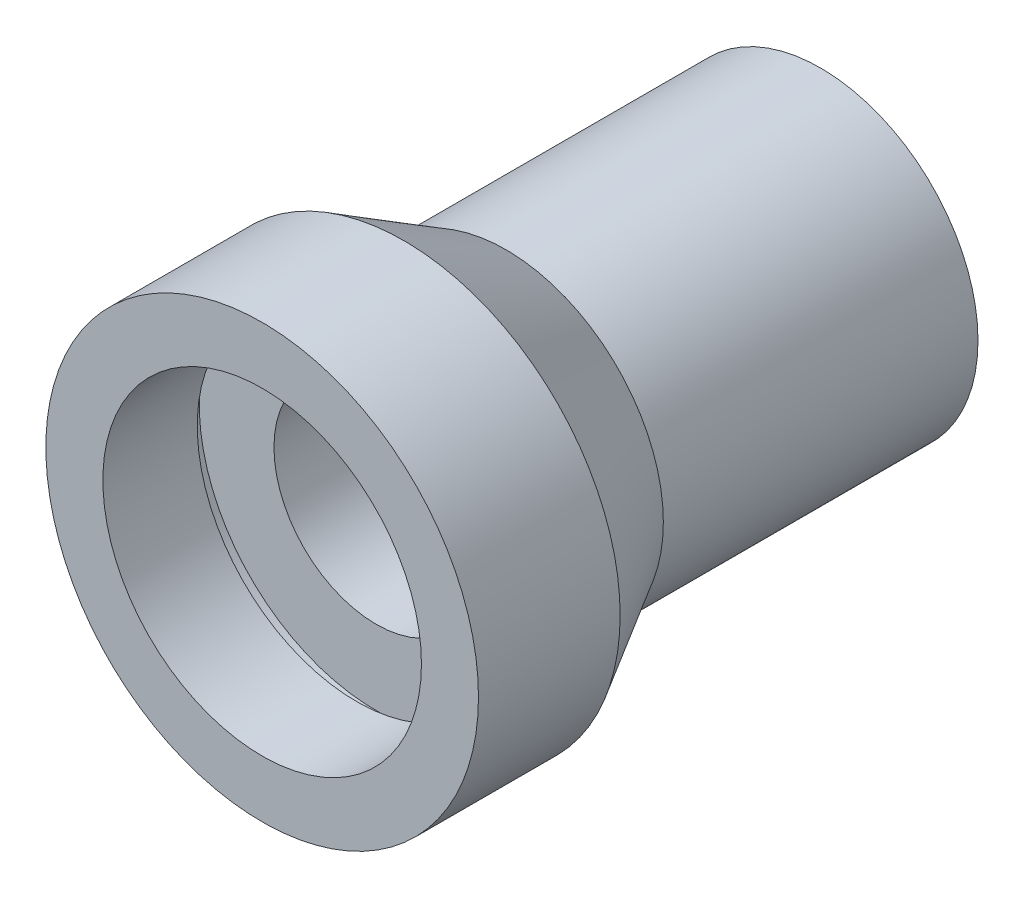
ISO-10303-21;
HEADER;
FILE_DESCRIPTION(('STEP AP214'),'2;1');
FILE_NAME('part.step','',(''),(''),'','','');
FILE_SCHEMA(('AUTOMOTIVE_DESIGN { 1 0 10303 214 1 1 1 1 }'));
ENDSEC;
DATA;
#1=APPLICATION_CONTEXT('core data for automotive mechanical design processes');
#2=APPLICATION_PROTOCOL_DEFINITION('international standard','automotive_design',2000,#1);
#3=PRODUCT_CONTEXT('',#1,'mechanical');
#4=PRODUCT('Part','Part','',(#3));
#5=PRODUCT_RELATED_PRODUCT_CATEGORY('part','',(#4));
#6=PRODUCT_DEFINITION_FORMATION('','',#4);
#7=PRODUCT_DEFINITION_CONTEXT('part definition',#1,'design');
#8=PRODUCT_DEFINITION('design','',#6,#7);
#9=PRODUCT_DEFINITION_SHAPE('','',#8);
#10=(LENGTH_UNIT() NAMED_UNIT(*) SI_UNIT(.MILLI.,.METRE.));
#11=(NAMED_UNIT(*) PLANE_ANGLE_UNIT() SI_UNIT($,.RADIAN.));
#12=(NAMED_UNIT(*) SI_UNIT($,.STERADIAN.) SOLID_ANGLE_UNIT());
#13=UNCERTAINTY_MEASURE_WITH_UNIT(LENGTH_MEASURE(1.E-05),#10,'distance_accuracy_value','');
#14=(GEOMETRIC_REPRESENTATION_CONTEXT(3) GLOBAL_UNCERTAINTY_ASSIGNED_CONTEXT((#13)) GLOBAL_UNIT_ASSIGNED_CONTEXT((#10,
#11,#12)) REPRESENTATION_CONTEXT('',''));
#15=CARTESIAN_POINT('',(0.,0.,0.));
#16=DIRECTION('',(0.,0.,1.));
#17=DIRECTION('',(1.,0.,0.));
#18=AXIS2_PLACEMENT_3D('',#15,#16,#17);
#19=CARTESIAN_POINT('',(0.,0.,-10.));
#20=DIRECTION('',(0.,0.,1.));
#21=DIRECTION('',(1.,0.,0.));
#22=AXIS2_PLACEMENT_3D('',#19,#20,#21);
#23=CYLINDRICAL_SURFACE('',#22,4.);
#24=CARTESIAN_POINT('',(0.,0.,-2.00000000000001));
#25=DIRECTION('',(0.,0.,1.));
#26=DIRECTION('',(1.,0.,0.));
#27=AXIS2_PLACEMENT_3D('',#24,#25,#26);
#28=CIRCLE('',#27,4.);
#29=CARTESIAN_POINT('',(4.,0.,-2.00000000000001));
#30=VERTEX_POINT('',#29);
#31=EDGE_CURVE('E44',#30,#30,#28,.F.);
#32=ORIENTED_EDGE('',*,*,#31,.T.);
#33=EDGE_LOOP('',(#32));
#34=FACE_BOUND('',#33,.T.);
#35=CARTESIAN_POINT('',(0.,0.,-10.));
#36=DIRECTION('',(0.,0.,1.));
#37=DIRECTION('',(1.,0.,0.));
#38=AXIS2_PLACEMENT_3D('',#35,#36,#37);
#39=CIRCLE('',#38,4.);
#40=CARTESIAN_POINT('',(4.,0.,-10.));
#41=VERTEX_POINT('',#40);
#42=EDGE_CURVE('E48',#41,#41,#39,.T.);
#43=ORIENTED_EDGE('',*,*,#42,.T.);
#44=EDGE_LOOP('',(#43));
#45=FACE_BOUND('',#44,.T.);
#46=ADVANCED_FACE('F36',(#34,#45),#23,.T.);
#47=CARTESIAN_POINT('',(0.,0.,-10.));
#48=DIRECTION('',(0.,0.,1.));
#49=DIRECTION('',(1.,0.,0.));
#50=AXIS2_PLACEMENT_3D('',#47,#48,#49);
#51=PLANE('',#50);
#52=CARTESIAN_POINT('',(0.,0.,-10.));
#53=DIRECTION('',(0.,0.,1.));
#54=DIRECTION('',(1.,0.,0.));
#55=AXIS2_PLACEMENT_3D('',#52,#53,#54);
#56=CIRCLE('',#55,2.6);
#57=CARTESIAN_POINT('',(2.6,0.,-10.));
#58=VERTEX_POINT('',#57);
#59=EDGE_CURVE('E52',#58,#58,#56,.T.);
#60=ORIENTED_EDGE('',*,*,#59,.T.);
#61=EDGE_LOOP('',(#60));
#62=FACE_BOUND('',#61,.T.);
#63=ORIENTED_EDGE('',*,*,#42,.F.);
#64=EDGE_LOOP('',(#63));
#65=FACE_BOUND('',#64,.T.);
#66=ADVANCED_FACE('F105',(#62,#65),#51,.F.);
#67=CARTESIAN_POINT('',(0.,0.,-10.));
#68=DIRECTION('',(0.,0.,1.));
#69=DIRECTION('',(1.,0.,0.));
#70=AXIS2_PLACEMENT_3D('',#67,#68,#69);
#71=CYLINDRICAL_SURFACE('',#70,2.6);
#72=ORIENTED_EDGE('',*,*,#59,.F.);
#73=EDGE_LOOP('',(#72));
#74=FACE_BOUND('',#73,.T.);
#75=CARTESIAN_POINT('',(0.,0.,1.3));
#76=DIRECTION('',(0.,0.,1.));
#77=DIRECTION('',(1.,0.,0.));
#78=AXIS2_PLACEMENT_3D('',#75,#76,#77);
#79=CIRCLE('',#78,2.6);
#80=CARTESIAN_POINT('',(2.6,0.,1.3));
#81=VERTEX_POINT('',#80);
#82=EDGE_CURVE('E58',#81,#81,#79,.T.);
#83=ORIENTED_EDGE('',*,*,#82,.T.);
#84=EDGE_LOOP('',(#83));
#85=FACE_BOUND('',#84,.T.);
#86=ADVANCED_FACE('F100',(#74,#85),#71,.F.);
#87=CARTESIAN_POINT('',(0.,0.,4.2));
#88=DIRECTION('',(0.,0.,-1.));
#89=DIRECTION('',(-1.,0.,0.));
#90=AXIS2_PLACEMENT_3D('',#87,#88,#89);
#91=CYLINDRICAL_SURFACE('',#90,5.5);
#92=CARTESIAN_POINT('',(0.,0.,0.598076211353264));
#93=DIRECTION('',(0.,0.,1.));
#94=DIRECTION('',(1.,0.,0.));
#95=AXIS2_PLACEMENT_3D('',#92,#93,#94);
#96=CIRCLE('',#95,5.5);
#97=CARTESIAN_POINT('',(5.5,0.,0.598076211353264));
#98=VERTEX_POINT('',#97);
#99=EDGE_CURVE('E10',#98,#98,#96,.T.);
#100=ORIENTED_EDGE('',*,*,#99,.T.);
#101=EDGE_LOOP('',(#100));
#102=FACE_BOUND('',#101,.T.);
#103=CARTESIAN_POINT('',(0.,0.,4.2));
#104=DIRECTION('',(0.,0.,1.));
#105=DIRECTION('',(1.,0.,0.));
#106=AXIS2_PLACEMENT_3D('',#103,#104,#105);
#107=CIRCLE('',#106,5.5);
#108=CARTESIAN_POINT('',(5.5,0.,4.2));
#109=VERTEX_POINT('',#108);
#110=EDGE_CURVE('E65',#109,#109,#107,.T.);
#111=ORIENTED_EDGE('',*,*,#110,.F.);
#112=EDGE_LOOP('',(#111));
#113=FACE_BOUND('',#112,.T.);
#114=ADVANCED_FACE('F95',(#102,#113),#91,.T.);
#115=CARTESIAN_POINT('',(0.,0.,4.2));
#116=DIRECTION('',(0.,0.,1.));
#117=DIRECTION('',(1.,0.,0.));
#118=AXIS2_PLACEMENT_3D('',#115,#116,#117);
#119=PLANE('',#118);
#120=CARTESIAN_POINT('',(0.,0.,4.2));
#121=DIRECTION('',(0.,0.,1.));
#122=DIRECTION('',(1.,0.,0.));
#123=AXIS2_PLACEMENT_3D('',#120,#121,#122);
#124=CIRCLE('',#123,4.05);
#125=CARTESIAN_POINT('',(4.05,0.,4.2));
#126=VERTEX_POINT('',#125);
#127=EDGE_CURVE('E61',#126,#126,#124,.T.);
#128=ORIENTED_EDGE('',*,*,#127,.F.);
#129=EDGE_LOOP('',(#128));
#130=FACE_BOUND('',#129,.T.);
#131=ORIENTED_EDGE('',*,*,#110,.T.);
#132=EDGE_LOOP('',(#131));
#133=FACE_BOUND('',#132,.T.);
#134=ADVANCED_FACE('F89',(#130,#133),#119,.T.);
#135=CARTESIAN_POINT('',(0.,0.,1.3));
#136=DIRECTION('',(0.,0.,1.));
#137=DIRECTION('',(1.,0.,0.));
#138=AXIS2_PLACEMENT_3D('',#135,#136,#137);
#139=CYLINDRICAL_SURFACE('',#138,4.05);
#140=CARTESIAN_POINT('',(0.,0.,1.8));
#141=DIRECTION('',(0.,0.,1.));
#142=DIRECTION('',(1.,0.,0.));
#143=AXIS2_PLACEMENT_3D('',#140,#141,#142);
#144=CIRCLE('',#143,4.05);
#145=CARTESIAN_POINT('',(4.05,0.,1.8));
#146=VERTEX_POINT('',#145);
#147=EDGE_CURVE('E55',#146,#146,#144,.F.);
#148=ORIENTED_EDGE('',*,*,#147,.T.);
#149=EDGE_LOOP('',(#148));
#150=FACE_BOUND('',#149,.T.);
#151=ORIENTED_EDGE('',*,*,#127,.T.);
#152=EDGE_LOOP('',(#151));
#153=FACE_BOUND('',#152,.T.);
#154=ADVANCED_FACE('F86',(#150,#153),#139,.F.);
#155=CARTESIAN_POINT('',(0.,0.,1.3));
#156=DIRECTION('',(0.,0.,1.));
#157=DIRECTION('',(1.,0.,0.));
#158=AXIS2_PLACEMENT_3D('',#155,#156,#157);
#159=PLANE('',#158);
#160=ORIENTED_EDGE('',*,*,#82,.F.);
#161=EDGE_LOOP('',(#160));
#162=FACE_BOUND('',#161,.T.);
#163=CARTESIAN_POINT('',(0.,0.,1.3));
#164=DIRECTION('',(0.,0.,1.));
#165=DIRECTION('',(1.,0.,0.));
#166=AXIS2_PLACEMENT_3D('',#163,#164,#165);
#167=CIRCLE('',#166,4.5);
#168=CARTESIAN_POINT('',(4.5,0.,1.3));
#169=VERTEX_POINT('',#168);
#170=EDGE_CURVE('E70',#169,#169,#167,.T.);
#171=ORIENTED_EDGE('',*,*,#170,.T.);
#172=EDGE_LOOP('',(#171));
#173=FACE_BOUND('',#172,.T.);
#174=ADVANCED_FACE('F82',(#162,#173),#159,.T.);
#175=CARTESIAN_POINT('',(0.,0.,1.8));
#176=DIRECTION('',(0.,0.,1.));
#177=DIRECTION('',(1.,0.,0.));
#178=AXIS2_PLACEMENT_3D('',#175,#176,#177);
#179=PLANE('',#178);
#180=CARTESIAN_POINT('',(0.,0.,1.8));
#181=DIRECTION('',(0.,0.,1.));
#182=DIRECTION('',(1.,0.,0.));
#183=AXIS2_PLACEMENT_3D('',#180,#181,#182);
#184=CIRCLE('',#183,4.5);
#185=CARTESIAN_POINT('',(4.5,0.,1.8));
#186=VERTEX_POINT('',#185);
#187=EDGE_CURVE('E59',#186,#186,#184,.T.);
#188=ORIENTED_EDGE('',*,*,#187,.F.);
#189=EDGE_LOOP('',(#188));
#190=FACE_BOUND('',#189,.T.);
#191=ORIENTED_EDGE('',*,*,#147,.F.);
#192=EDGE_LOOP('',(#191));
#193=FACE_BOUND('',#192,.T.);
#194=ADVANCED_FACE('F79',(#190,#193),#179,.F.);
#195=CARTESIAN_POINT('',(0.,0.,1.8));
#196=DIRECTION('',(0.,0.,-1.));
#197=DIRECTION('',(-1.,0.,0.));
#198=AXIS2_PLACEMENT_3D('',#195,#196,#197);
#199=CYLINDRICAL_SURFACE('',#198,4.5);
#200=ORIENTED_EDGE('',*,*,#187,.T.);
#201=EDGE_LOOP('',(#200));
#202=FACE_BOUND('',#201,.T.);
#203=ORIENTED_EDGE('',*,*,#170,.F.);
#204=EDGE_LOOP('',(#203));
#205=FACE_BOUND('',#204,.T.);
#206=ADVANCED_FACE('F76',(#202,#205),#199,.F.);
#207=CARTESIAN_POINT('',(0.,0.,0.999999999999999));
#208=DIRECTION('',(0.,0.,1.));
#209=DIRECTION('',(1.,0.,0.));
#210=AXIS2_PLACEMENT_3D('',#207,#208,#209);
#211=CONICAL_SURFACE('',#210,5.73205080756891,0.523598775598305);
#212=ORIENTED_EDGE('',*,*,#31,.F.);
#213=EDGE_LOOP('',(#212));
#214=FACE_BOUND('',#213,.T.);
#215=ORIENTED_EDGE('',*,*,#99,.F.);
#216=EDGE_LOOP('',(#215));
#217=FACE_BOUND('',#216,.T.);
#218=ADVANCED_FACE('F39',(#214,#217),#211,.T.);
#219=CLOSED_SHELL('',(#46,#66,#86,#114,#134,#154,#174,#194,#206,#218));
#220=MANIFOLD_SOLID_BREP('B2',#219);
#221=ADVANCED_BREP_SHAPE_REPRESENTATION('',(#18,#220),#14);
#222=SHAPE_DEFINITION_REPRESENTATION(#9,#221);
ENDSEC;
END-ISO-10303-21;
